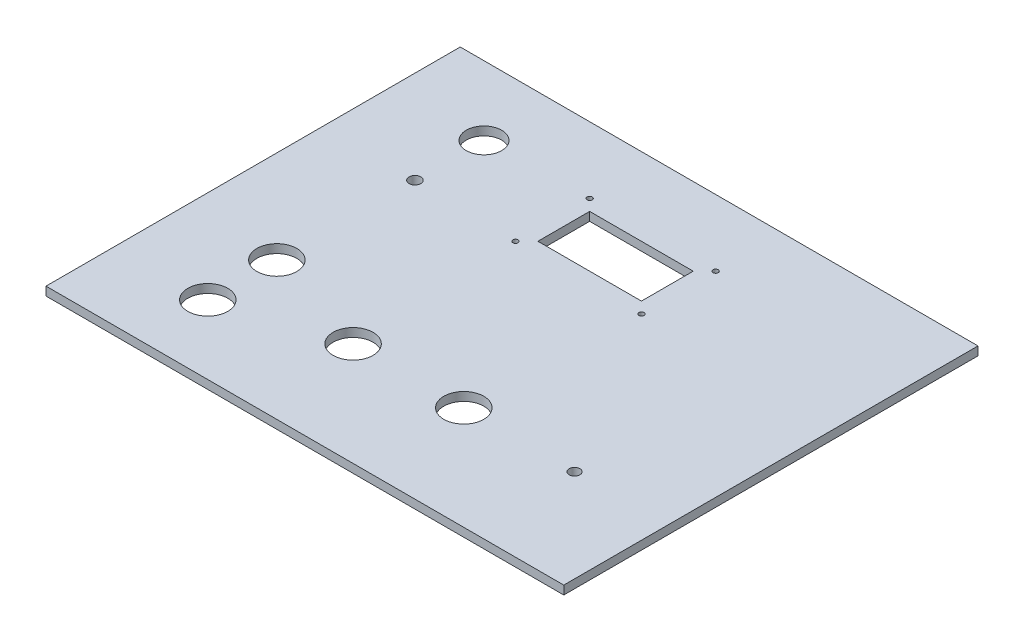
ISO-10303-21;
HEADER;
FILE_DESCRIPTION(('STEP AP214'),'2;1');
FILE_NAME('part.step','',(''),(''),'','','');
FILE_SCHEMA(('AUTOMOTIVE_DESIGN { 1 0 10303 214 1 1 1 1 }'));
ENDSEC;
DATA;
#1=APPLICATION_CONTEXT('core data for automotive mechanical design processes');
#2=APPLICATION_PROTOCOL_DEFINITION('international standard','automotive_design',2000,#1);
#3=PRODUCT_CONTEXT('',#1,'mechanical');
#4=PRODUCT('Part','Part','',(#3));
#5=PRODUCT_RELATED_PRODUCT_CATEGORY('part','',(#4));
#6=PRODUCT_DEFINITION_FORMATION('','',#4);
#7=PRODUCT_DEFINITION_CONTEXT('part definition',#1,'design');
#8=PRODUCT_DEFINITION('design','',#6,#7);
#9=PRODUCT_DEFINITION_SHAPE('','',#8);
#10=(LENGTH_UNIT() NAMED_UNIT(*) SI_UNIT(.MILLI.,.METRE.));
#11=(NAMED_UNIT(*) PLANE_ANGLE_UNIT() SI_UNIT($,.RADIAN.));
#12=(NAMED_UNIT(*) SI_UNIT($,.STERADIAN.) SOLID_ANGLE_UNIT());
#13=UNCERTAINTY_MEASURE_WITH_UNIT(LENGTH_MEASURE(1.E-05),#10,'distance_accuracy_value','');
#14=(GEOMETRIC_REPRESENTATION_CONTEXT(3) GLOBAL_UNCERTAINTY_ASSIGNED_CONTEXT((#13)) GLOBAL_UNIT_ASSIGNED_CONTEXT((#10,
#11,#12)) REPRESENTATION_CONTEXT('',''));
#15=CARTESIAN_POINT('',(0.,0.,0.));
#16=DIRECTION('',(0.,0.,1.));
#17=DIRECTION('',(1.,0.,0.));
#18=AXIS2_PLACEMENT_3D('',#15,#16,#17);
#19=CARTESIAN_POINT('',(150.,5.,120.));
#20=DIRECTION('',(-1.,0.,0.));
#21=DIRECTION('',(0.,0.,1.));
#22=AXIS2_PLACEMENT_3D('',#19,#20,#21);
#23=PLANE('',#22);
#24=DIRECTION('',(0.,0.,-1.));
#25=VECTOR('',#24,1.);
#26=CARTESIAN_POINT('',(150.,0.,120.));
#27=LINE('',#26,#25);
#28=CARTESIAN_POINT('',(150.,0.,120.));
#29=VERTEX_POINT('',#28);
#30=CARTESIAN_POINT('',(150.,0.,-120.));
#31=VERTEX_POINT('',#30);
#32=EDGE_CURVE('E215',#29,#31,#27,.T.);
#33=ORIENTED_EDGE('',*,*,#32,.T.);
#34=DIRECTION('',(0.,-1.,0.));
#35=VECTOR('',#34,1.);
#36=CARTESIAN_POINT('',(150.,5.,-120.));
#37=LINE('',#36,#35);
#38=CARTESIAN_POINT('',(150.,5.,-120.));
#39=VERTEX_POINT('',#38);
#40=EDGE_CURVE('E11',#39,#31,#37,.T.);
#41=ORIENTED_EDGE('',*,*,#40,.F.);
#42=DIRECTION('',(0.,0.,-1.));
#43=VECTOR('',#42,1.);
#44=CARTESIAN_POINT('',(150.,5.,120.));
#45=LINE('',#44,#43);
#46=CARTESIAN_POINT('',(150.,5.,120.));
#47=VERTEX_POINT('',#46);
#48=EDGE_CURVE('E219',#47,#39,#45,.T.);
#49=ORIENTED_EDGE('',*,*,#48,.F.);
#50=DIRECTION('',(0.,-1.,0.));
#51=VECTOR('',#50,1.);
#52=CARTESIAN_POINT('',(150.,5.,120.));
#53=LINE('',#52,#51);
#54=EDGE_CURVE('E233',#47,#29,#53,.T.);
#55=ORIENTED_EDGE('',*,*,#54,.T.);
#56=EDGE_LOOP('',(#33,#41,#49,#55));
#57=FACE_BOUND('',#56,.T.);
#58=ADVANCED_FACE('F37',(#57),#23,.F.);
#59=CARTESIAN_POINT('',(-150.,5.,-120.));
#60=DIRECTION('',(0.,0.,1.));
#61=DIRECTION('',(1.,0.,0.));
#62=AXIS2_PLACEMENT_3D('',#59,#60,#61);
#63=PLANE('',#62);
#64=DIRECTION('',(-1.,0.,0.));
#65=VECTOR('',#64,1.);
#66=CARTESIAN_POINT('',(-150.,0.,-120.));
#67=LINE('',#66,#65);
#68=CARTESIAN_POINT('',(-150.,0.,-120.));
#69=VERTEX_POINT('',#68);
#70=EDGE_CURVE('E237',#31,#69,#67,.T.);
#71=ORIENTED_EDGE('',*,*,#70,.T.);
#72=DIRECTION('',(0.,-1.,0.));
#73=VECTOR('',#72,1.);
#74=CARTESIAN_POINT('',(-150.,5.,-120.));
#75=LINE('',#74,#73);
#76=CARTESIAN_POINT('',(-150.,5.,-120.));
#77=VERTEX_POINT('',#76);
#78=EDGE_CURVE('E45',#77,#69,#75,.T.);
#79=ORIENTED_EDGE('',*,*,#78,.F.);
#80=DIRECTION('',(-1.,0.,0.));
#81=VECTOR('',#80,1.);
#82=CARTESIAN_POINT('',(-150.,5.,-120.));
#83=LINE('',#82,#81);
#84=EDGE_CURVE('E223',#39,#77,#83,.T.);
#85=ORIENTED_EDGE('',*,*,#84,.F.);
#86=ORIENTED_EDGE('',*,*,#40,.T.);
#87=EDGE_LOOP('',(#71,#79,#85,#86));
#88=FACE_BOUND('',#87,.T.);
#89=ADVANCED_FACE('F273',(#88),#63,.F.);
#90=CARTESIAN_POINT('',(-150.,5.,120.));
#91=DIRECTION('',(1.,0.,0.));
#92=DIRECTION('',(0.,0.,-1.));
#93=AXIS2_PLACEMENT_3D('',#90,#91,#92);
#94=PLANE('',#93);
#95=DIRECTION('',(0.,0.,1.));
#96=VECTOR('',#95,1.);
#97=CARTESIAN_POINT('',(-150.,0.,120.));
#98=LINE('',#97,#96);
#99=CARTESIAN_POINT('',(-150.,0.,120.));
#100=VERTEX_POINT('',#99);
#101=EDGE_CURVE('E240',#69,#100,#98,.T.);
#102=ORIENTED_EDGE('',*,*,#101,.T.);
#103=DIRECTION('',(0.,-1.,0.));
#104=VECTOR('',#103,1.);
#105=CARTESIAN_POINT('',(-150.,5.,120.));
#106=LINE('',#105,#104);
#107=CARTESIAN_POINT('',(-150.,5.,120.));
#108=VERTEX_POINT('',#107);
#109=EDGE_CURVE('E248',#108,#100,#106,.T.);
#110=ORIENTED_EDGE('',*,*,#109,.F.);
#111=DIRECTION('',(0.,0.,1.));
#112=VECTOR('',#111,1.);
#113=CARTESIAN_POINT('',(-150.,5.,120.));
#114=LINE('',#113,#112);
#115=EDGE_CURVE('E227',#77,#108,#114,.T.);
#116=ORIENTED_EDGE('',*,*,#115,.F.);
#117=ORIENTED_EDGE('',*,*,#78,.T.);
#118=EDGE_LOOP('',(#102,#110,#116,#117));
#119=FACE_BOUND('',#118,.T.);
#120=ADVANCED_FACE('F258',(#119),#94,.F.);
#121=CARTESIAN_POINT('',(-150.,5.,120.));
#122=DIRECTION('',(0.,0.,-1.));
#123=DIRECTION('',(-1.,0.,0.));
#124=AXIS2_PLACEMENT_3D('',#121,#122,#123);
#125=PLANE('',#124);
#126=DIRECTION('',(1.,0.,0.));
#127=VECTOR('',#126,1.);
#128=CARTESIAN_POINT('',(-150.,0.,120.));
#129=LINE('',#128,#127);
#130=EDGE_CURVE('E224',#100,#29,#129,.T.);
#131=ORIENTED_EDGE('',*,*,#130,.T.);
#132=ORIENTED_EDGE('',*,*,#54,.F.);
#133=DIRECTION('',(1.,0.,0.));
#134=VECTOR('',#133,1.);
#135=CARTESIAN_POINT('',(-150.,5.,120.));
#136=LINE('',#135,#134);
#137=EDGE_CURVE('E230',#108,#47,#136,.T.);
#138=ORIENTED_EDGE('',*,*,#137,.F.);
#139=ORIENTED_EDGE('',*,*,#109,.T.);
#140=EDGE_LOOP('',(#131,#132,#138,#139));
#141=FACE_BOUND('',#140,.T.);
#142=ADVANCED_FACE('F267',(#141),#125,.F.);
#143=CARTESIAN_POINT('',(0.,5.,0.));
#144=DIRECTION('',(0.,-1.,0.));
#145=DIRECTION('',(0.,0.,-1.));
#146=AXIS2_PLACEMENT_3D('',#143,#144,#145);
#147=PLANE('',#146);
#148=CARTESIAN_POINT('',(-96.2500000000001,5.,40.));
#149=DIRECTION('',(0.,1.,0.));
#150=DIRECTION('',(0.,0.,1.));
#151=AXIS2_PLACEMENT_3D('',#148,#149,#150);
#152=CIRCLE('',#151,11.58);
#153=CARTESIAN_POINT('',(-96.2500000000001,5.,51.58));
#154=VERTEX_POINT('',#153);
#155=EDGE_CURVE('E170',#154,#154,#152,.T.);
#156=ORIENTED_EDGE('',*,*,#155,.F.);
#157=EDGE_LOOP('',(#156));
#158=FACE_BOUND('',#157,.T.);
#159=CARTESIAN_POINT('',(-96.2500000000001,5.,-40.));
#160=DIRECTION('',(0.,1.,0.));
#161=DIRECTION('',(0.,0.,1.));
#162=AXIS2_PLACEMENT_3D('',#159,#160,#161);
#163=CIRCLE('',#162,3.4);
#164=CARTESIAN_POINT('',(-96.2500000000001,5.,-36.6));
#165=VERTEX_POINT('',#164);
#166=EDGE_CURVE('E162',#165,#165,#163,.T.);
#167=ORIENTED_EDGE('',*,*,#166,.F.);
#168=EDGE_LOOP('',(#167));
#169=FACE_BOUND('',#168,.T.);
#170=CARTESIAN_POINT('',(-96.2500000000001,5.,-80.));
#171=DIRECTION('',(0.,1.,0.));
#172=DIRECTION('',(0.,0.,1.));
#173=AXIS2_PLACEMENT_3D('',#170,#171,#172);
#174=CIRCLE('',#173,10.25);
#175=CARTESIAN_POINT('',(-96.2500000000001,5.,-69.75));
#176=VERTEX_POINT('',#175);
#177=EDGE_CURVE('E139',#176,#176,#174,.T.);
#178=ORIENTED_EDGE('',*,*,#177,.F.);
#179=EDGE_LOOP('',(#178));
#180=FACE_BOUND('',#179,.T.);
#181=DIRECTION('',(0.,0.,-1.));
#182=VECTOR('',#181,1.);
#183=CARTESIAN_POINT('',(30.,5.,-45.));
#184=LINE('',#183,#182);
#185=CARTESIAN_POINT('',(30.,5.,-45.));
#186=VERTEX_POINT('',#185);
#187=CARTESIAN_POINT('',(30.,5.,-75.));
#188=VERTEX_POINT('',#187);
#189=EDGE_CURVE('E102',#186,#188,#184,.T.);
#190=ORIENTED_EDGE('',*,*,#189,.F.);
#191=DIRECTION('',(1.,0.,0.));
#192=VECTOR('',#191,1.);
#193=CARTESIAN_POINT('',(-30.,5.,-45.));
#194=LINE('',#193,#192);
#195=CARTESIAN_POINT('',(-30.,5.,-45.));
#196=VERTEX_POINT('',#195);
#197=EDGE_CURVE('E131',#196,#186,#194,.T.);
#198=ORIENTED_EDGE('',*,*,#197,.F.);
#199=DIRECTION('',(0.,0.,1.));
#200=VECTOR('',#199,1.);
#201=CARTESIAN_POINT('',(-30.,5.,-45.));
#202=LINE('',#201,#200);
#203=CARTESIAN_POINT('',(-30.,5.,-75.));
#204=VERTEX_POINT('',#203);
#205=EDGE_CURVE('E126',#204,#196,#202,.T.);
#206=ORIENTED_EDGE('',*,*,#205,.F.);
#207=DIRECTION('',(-1.,0.,0.));
#208=VECTOR('',#207,1.);
#209=CARTESIAN_POINT('',(-30.,5.,-75.));
#210=LINE('',#209,#208);
#211=EDGE_CURVE('E111',#188,#204,#210,.T.);
#212=ORIENTED_EDGE('',*,*,#211,.F.);
#213=EDGE_LOOP('',(#190,#198,#206,#212));
#214=FACE_BOUND('',#213,.T.);
#215=CARTESIAN_POINT('',(96.2500000000001,5.,60.));
#216=DIRECTION('',(0.,1.,0.));
#217=DIRECTION('',(0.,0.,1.));
#218=AXIS2_PLACEMENT_3D('',#215,#216,#217);
#219=CIRCLE('',#218,3.1);
#220=CARTESIAN_POINT('',(96.2500000000001,5.,63.1));
#221=VERTEX_POINT('',#220);
#222=EDGE_CURVE('E204',#221,#221,#219,.T.);
#223=ORIENTED_EDGE('',*,*,#222,.F.);
#224=EDGE_LOOP('',(#223));
#225=FACE_BOUND('',#224,.T.);
#226=CARTESIAN_POINT('',(-36.5,5.,-38.5));
#227=DIRECTION('',(0.,1.,0.));
#228=DIRECTION('',(0.,0.,1.));
#229=AXIS2_PLACEMENT_3D('',#226,#227,#228);
#230=CIRCLE('',#229,1.5);
#231=CARTESIAN_POINT('',(-36.5,5.,-37.));
#232=VERTEX_POINT('',#231);
#233=EDGE_CURVE('E196',#232,#232,#230,.T.);
#234=ORIENTED_EDGE('',*,*,#233,.F.);
#235=EDGE_LOOP('',(#234));
#236=FACE_BOUND('',#235,.T.);
#237=CARTESIAN_POINT('',(-36.5,5.,-81.5));
#238=DIRECTION('',(0.,1.,0.));
#239=DIRECTION('',(0.,0.,1.));
#240=AXIS2_PLACEMENT_3D('',#237,#238,#239);
#241=CIRCLE('',#240,1.5);
#242=CARTESIAN_POINT('',(-36.5,5.,-80.));
#243=VERTEX_POINT('',#242);
#244=EDGE_CURVE('E188',#243,#243,#241,.T.);
#245=ORIENTED_EDGE('',*,*,#244,.F.);
#246=EDGE_LOOP('',(#245));
#247=FACE_BOUND('',#246,.T.);
#248=CARTESIAN_POINT('',(36.5,5.,-81.5));
#249=DIRECTION('',(0.,1.,0.));
#250=DIRECTION('',(0.,0.,1.));
#251=AXIS2_PLACEMENT_3D('',#248,#249,#250);
#252=CIRCLE('',#251,1.5);
#253=CARTESIAN_POINT('',(36.5,5.,-80.));
#254=VERTEX_POINT('',#253);
#255=EDGE_CURVE('E179',#254,#254,#252,.T.);
#256=ORIENTED_EDGE('',*,*,#255,.F.);
#257=EDGE_LOOP('',(#256));
#258=FACE_BOUND('',#257,.T.);
#259=CARTESIAN_POINT('',(-96.2500000000001,5.,80.));
#260=DIRECTION('',(0.,1.,0.));
#261=DIRECTION('',(0.,0.,1.));
#262=AXIS2_PLACEMENT_3D('',#259,#260,#261);
#263=CIRCLE('',#262,11.58);
#264=CARTESIAN_POINT('',(-96.2500000000001,5.,91.58));
#265=VERTEX_POINT('',#264);
#266=EDGE_CURVE('E178',#265,#265,#263,.T.);
#267=ORIENTED_EDGE('',*,*,#266,.F.);
#268=EDGE_LOOP('',(#267));
#269=FACE_BOUND('',#268,.T.);
#270=CARTESIAN_POINT('',(-32.0800000000001,5.,60.));
#271=DIRECTION('',(0.,1.,0.));
#272=DIRECTION('',(0.,0.,1.));
#273=AXIS2_PLACEMENT_3D('',#270,#271,#272);
#274=CIRCLE('',#273,11.58);
#275=CARTESIAN_POINT('',(-32.0800000000001,5.,71.58));
#276=VERTEX_POINT('',#275);
#277=EDGE_CURVE('E353',#276,#276,#274,.T.);
#278=ORIENTED_EDGE('',*,*,#277,.F.);
#279=EDGE_LOOP('',(#278));
#280=FACE_BOUND('',#279,.T.);
#281=CARTESIAN_POINT('',(32.0800000000001,5.,60.));
#282=DIRECTION('',(0.,1.,0.));
#283=DIRECTION('',(0.,0.,1.));
#284=AXIS2_PLACEMENT_3D('',#281,#282,#283);
#285=CIRCLE('',#284,11.58);
#286=CARTESIAN_POINT('',(32.0800000000001,5.,71.58));
#287=VERTEX_POINT('',#286);
#288=EDGE_CURVE('E366',#287,#287,#285,.T.);
#289=ORIENTED_EDGE('',*,*,#288,.F.);
#290=EDGE_LOOP('',(#289));
#291=FACE_BOUND('',#290,.T.);
#292=CARTESIAN_POINT('',(36.5,5.,-38.5));
#293=DIRECTION('',(0.,1.,0.));
#294=DIRECTION('',(0.,0.,1.));
#295=AXIS2_PLACEMENT_3D('',#292,#293,#294);
#296=CIRCLE('',#295,1.5);
#297=CARTESIAN_POINT('',(36.5,5.,-37.));
#298=VERTEX_POINT('',#297);
#299=EDGE_CURVE('E211',#298,#298,#296,.T.);
#300=ORIENTED_EDGE('',*,*,#299,.F.);
#301=EDGE_LOOP('',(#300));
#302=FACE_BOUND('',#301,.T.);
#303=ORIENTED_EDGE('',*,*,#48,.T.);
#304=ORIENTED_EDGE('',*,*,#84,.T.);
#305=ORIENTED_EDGE('',*,*,#115,.T.);
#306=ORIENTED_EDGE('',*,*,#137,.T.);
#307=EDGE_LOOP('',(#303,#304,#305,#306));
#308=FACE_BOUND('',#307,.T.);
#309=ADVANCED_FACE('F124',(#158,#169,#180,#214,#225,#236,#247,#258,#269,#280,#291,#302,#308),
#147,.F.);
#310=CARTESIAN_POINT('',(0.,0.,0.));
#311=DIRECTION('',(0.,-1.,0.));
#312=DIRECTION('',(0.,0.,-1.));
#313=AXIS2_PLACEMENT_3D('',#310,#311,#312);
#314=PLANE('',#313);
#315=CARTESIAN_POINT('',(-96.2500000000001,0.,40.));
#316=DIRECTION('',(0.,1.,0.));
#317=DIRECTION('',(0.,0.,1.));
#318=AXIS2_PLACEMENT_3D('',#315,#316,#317);
#319=CIRCLE('',#318,11.58);
#320=CARTESIAN_POINT('',(-96.2500000000001,0.,51.58));
#321=VERTEX_POINT('',#320);
#322=EDGE_CURVE('E174',#321,#321,#319,.T.);
#323=ORIENTED_EDGE('',*,*,#322,.T.);
#324=EDGE_LOOP('',(#323));
#325=FACE_BOUND('',#324,.T.);
#326=CARTESIAN_POINT('',(-96.2500000000001,0.,-40.));
#327=DIRECTION('',(0.,1.,0.));
#328=DIRECTION('',(0.,0.,1.));
#329=AXIS2_PLACEMENT_3D('',#326,#327,#328);
#330=CIRCLE('',#329,3.4);
#331=CARTESIAN_POINT('',(-96.2500000000001,0.,-36.6));
#332=VERTEX_POINT('',#331);
#333=EDGE_CURVE('E166',#332,#332,#330,.T.);
#334=ORIENTED_EDGE('',*,*,#333,.T.);
#335=EDGE_LOOP('',(#334));
#336=FACE_BOUND('',#335,.T.);
#337=CARTESIAN_POINT('',(-96.2500000000001,0.,-80.));
#338=DIRECTION('',(0.,1.,0.));
#339=DIRECTION('',(0.,0.,1.));
#340=AXIS2_PLACEMENT_3D('',#337,#338,#339);
#341=CIRCLE('',#340,10.25);
#342=CARTESIAN_POINT('',(-96.2500000000001,0.,-69.75));
#343=VERTEX_POINT('',#342);
#344=EDGE_CURVE('E158',#343,#343,#341,.T.);
#345=ORIENTED_EDGE('',*,*,#344,.T.);
#346=EDGE_LOOP('',(#345));
#347=FACE_BOUND('',#346,.T.);
#348=DIRECTION('',(1.,0.,0.));
#349=VECTOR('',#348,1.);
#350=CARTESIAN_POINT('',(-30.,0.,-45.));
#351=LINE('',#350,#349);
#352=CARTESIAN_POINT('',(-30.,0.,-45.));
#353=VERTEX_POINT('',#352);
#354=CARTESIAN_POINT('',(30.,0.,-45.));
#355=VERTEX_POINT('',#354);
#356=EDGE_CURVE('E112',#353,#355,#351,.T.);
#357=ORIENTED_EDGE('',*,*,#356,.T.);
#358=DIRECTION('',(0.,0.,-1.));
#359=VECTOR('',#358,1.);
#360=CARTESIAN_POINT('',(30.,0.,-45.));
#361=LINE('',#360,#359);
#362=CARTESIAN_POINT('',(30.,0.,-75.));
#363=VERTEX_POINT('',#362);
#364=EDGE_CURVE('E60',#355,#363,#361,.T.);
#365=ORIENTED_EDGE('',*,*,#364,.T.);
#366=DIRECTION('',(-1.,0.,0.));
#367=VECTOR('',#366,1.);
#368=CARTESIAN_POINT('',(-30.,0.,-75.));
#369=LINE('',#368,#367);
#370=CARTESIAN_POINT('',(-30.,0.,-75.));
#371=VERTEX_POINT('',#370);
#372=EDGE_CURVE('E118',#363,#371,#369,.T.);
#373=ORIENTED_EDGE('',*,*,#372,.T.);
#374=DIRECTION('',(0.,0.,1.));
#375=VECTOR('',#374,1.);
#376=CARTESIAN_POINT('',(-30.,0.,-45.));
#377=LINE('',#376,#375);
#378=EDGE_CURVE('E142',#371,#353,#377,.T.);
#379=ORIENTED_EDGE('',*,*,#378,.T.);
#380=EDGE_LOOP('',(#357,#365,#373,#379));
#381=FACE_BOUND('',#380,.T.);
#382=CARTESIAN_POINT('',(96.2500000000001,0.,60.));
#383=DIRECTION('',(0.,1.,0.));
#384=DIRECTION('',(0.,0.,1.));
#385=AXIS2_PLACEMENT_3D('',#382,#383,#384);
#386=CIRCLE('',#385,3.1);
#387=CARTESIAN_POINT('',(96.2500000000001,0.,63.1));
#388=VERTEX_POINT('',#387);
#389=EDGE_CURVE('E120',#388,#388,#386,.T.);
#390=ORIENTED_EDGE('',*,*,#389,.T.);
#391=EDGE_LOOP('',(#390));
#392=FACE_BOUND('',#391,.T.);
#393=CARTESIAN_POINT('',(-36.5,0.,-38.5));
#394=DIRECTION('',(0.,1.,0.));
#395=DIRECTION('',(0.,0.,1.));
#396=AXIS2_PLACEMENT_3D('',#393,#394,#395);
#397=CIRCLE('',#396,1.5);
#398=CARTESIAN_POINT('',(-36.5,0.,-37.));
#399=VERTEX_POINT('',#398);
#400=EDGE_CURVE('E200',#399,#399,#397,.T.);
#401=ORIENTED_EDGE('',*,*,#400,.T.);
#402=EDGE_LOOP('',(#401));
#403=FACE_BOUND('',#402,.T.);
#404=CARTESIAN_POINT('',(-36.5,0.,-81.5));
#405=DIRECTION('',(0.,1.,0.));
#406=DIRECTION('',(0.,0.,1.));
#407=AXIS2_PLACEMENT_3D('',#404,#405,#406);
#408=CIRCLE('',#407,1.5);
#409=CARTESIAN_POINT('',(-36.5,0.,-80.));
#410=VERTEX_POINT('',#409);
#411=EDGE_CURVE('E192',#410,#410,#408,.T.);
#412=ORIENTED_EDGE('',*,*,#411,.T.);
#413=EDGE_LOOP('',(#412));
#414=FACE_BOUND('',#413,.T.);
#415=CARTESIAN_POINT('',(36.5,0.,-81.5));
#416=DIRECTION('',(0.,1.,0.));
#417=DIRECTION('',(0.,0.,1.));
#418=AXIS2_PLACEMENT_3D('',#415,#416,#417);
#419=CIRCLE('',#418,1.5);
#420=CARTESIAN_POINT('',(36.5,0.,-80.));
#421=VERTEX_POINT('',#420);
#422=EDGE_CURVE('E184',#421,#421,#419,.T.);
#423=ORIENTED_EDGE('',*,*,#422,.T.);
#424=EDGE_LOOP('',(#423));
#425=FACE_BOUND('',#424,.T.);
#426=CARTESIAN_POINT('',(-96.2500000000001,0.,80.));
#427=DIRECTION('',(0.,1.,0.));
#428=DIRECTION('',(0.,0.,1.));
#429=AXIS2_PLACEMENT_3D('',#426,#427,#428);
#430=CIRCLE('',#429,11.58);
#431=CARTESIAN_POINT('',(-96.2500000000001,0.,91.58));
#432=VERTEX_POINT('',#431);
#433=EDGE_CURVE('E350',#432,#432,#430,.T.);
#434=ORIENTED_EDGE('',*,*,#433,.T.);
#435=EDGE_LOOP('',(#434));
#436=FACE_BOUND('',#435,.T.);
#437=CARTESIAN_POINT('',(-32.0800000000001,0.,60.));
#438=DIRECTION('',(0.,1.,0.));
#439=DIRECTION('',(0.,0.,1.));
#440=AXIS2_PLACEMENT_3D('',#437,#438,#439);
#441=CIRCLE('',#440,11.58);
#442=CARTESIAN_POINT('',(-32.0800000000001,0.,71.58));
#443=VERTEX_POINT('',#442);
#444=EDGE_CURVE('E360',#443,#443,#441,.T.);
#445=ORIENTED_EDGE('',*,*,#444,.T.);
#446=EDGE_LOOP('',(#445));
#447=FACE_BOUND('',#446,.T.);
#448=CARTESIAN_POINT('',(32.0800000000001,0.,60.));
#449=DIRECTION('',(0.,1.,0.));
#450=DIRECTION('',(0.,0.,1.));
#451=AXIS2_PLACEMENT_3D('',#448,#449,#450);
#452=CIRCLE('',#451,11.58);
#453=CARTESIAN_POINT('',(32.0800000000001,0.,71.58));
#454=VERTEX_POINT('',#453);
#455=EDGE_CURVE('E369',#454,#454,#452,.T.);
#456=ORIENTED_EDGE('',*,*,#455,.T.);
#457=EDGE_LOOP('',(#456));
#458=FACE_BOUND('',#457,.T.);
#459=CARTESIAN_POINT('',(36.5,0.,-38.5));
#460=DIRECTION('',(0.,1.,0.));
#461=DIRECTION('',(0.,0.,1.));
#462=AXIS2_PLACEMENT_3D('',#459,#460,#461);
#463=CIRCLE('',#462,1.5);
#464=CARTESIAN_POINT('',(36.5,0.,-37.));
#465=VERTEX_POINT('',#464);
#466=EDGE_CURVE('E183',#465,#465,#463,.T.);
#467=ORIENTED_EDGE('',*,*,#466,.T.);
#468=EDGE_LOOP('',(#467));
#469=FACE_BOUND('',#468,.T.);
#470=ORIENTED_EDGE('',*,*,#32,.F.);
#471=ORIENTED_EDGE('',*,*,#130,.F.);
#472=ORIENTED_EDGE('',*,*,#101,.F.);
#473=ORIENTED_EDGE('',*,*,#70,.F.);
#474=EDGE_LOOP('',(#470,#471,#472,#473));
#475=FACE_BOUND('',#474,.T.);
#476=ADVANCED_FACE('F264',(#325,#336,#347,#381,#392,#403,#414,#425,#436,#447,#458,#469,#475),
#314,.T.);
#477=CARTESIAN_POINT('',(36.5,5.,-38.5));
#478=DIRECTION('',(0.,-1.,0.));
#479=DIRECTION('',(0.,0.,-1.));
#480=AXIS2_PLACEMENT_3D('',#477,#478,#479);
#481=CYLINDRICAL_SURFACE('',#480,1.5);
#482=ORIENTED_EDGE('',*,*,#299,.T.);
#483=EDGE_LOOP('',(#482));
#484=FACE_BOUND('',#483,.T.);
#485=ORIENTED_EDGE('',*,*,#466,.F.);
#486=EDGE_LOOP('',(#485));
#487=FACE_BOUND('',#486,.T.);
#488=ADVANCED_FACE('F285',(#484,#487),#481,.F.);
#489=CARTESIAN_POINT('',(32.0800000000001,5.,60.));
#490=DIRECTION('',(0.,-1.,0.));
#491=DIRECTION('',(0.,0.,-1.));
#492=AXIS2_PLACEMENT_3D('',#489,#490,#491);
#493=CYLINDRICAL_SURFACE('',#492,11.58);
#494=ORIENTED_EDGE('',*,*,#288,.T.);
#495=EDGE_LOOP('',(#494));
#496=FACE_BOUND('',#495,.T.);
#497=ORIENTED_EDGE('',*,*,#455,.F.);
#498=EDGE_LOOP('',(#497));
#499=FACE_BOUND('',#498,.T.);
#500=ADVANCED_FACE('F292',(#496,#499),#493,.F.);
#501=CARTESIAN_POINT('',(-32.0800000000001,5.,60.));
#502=DIRECTION('',(0.,-1.,0.));
#503=DIRECTION('',(0.,0.,-1.));
#504=AXIS2_PLACEMENT_3D('',#501,#502,#503);
#505=CYLINDRICAL_SURFACE('',#504,11.58);
#506=ORIENTED_EDGE('',*,*,#277,.T.);
#507=EDGE_LOOP('',(#506));
#508=FACE_BOUND('',#507,.T.);
#509=ORIENTED_EDGE('',*,*,#444,.F.);
#510=EDGE_LOOP('',(#509));
#511=FACE_BOUND('',#510,.T.);
#512=ADVANCED_FACE('F336',(#508,#511),#505,.F.);
#513=CARTESIAN_POINT('',(-96.2500000000001,5.,80.));
#514=DIRECTION('',(0.,-1.,0.));
#515=DIRECTION('',(0.,0.,-1.));
#516=AXIS2_PLACEMENT_3D('',#513,#514,#515);
#517=CYLINDRICAL_SURFACE('',#516,11.58);
#518=ORIENTED_EDGE('',*,*,#266,.T.);
#519=EDGE_LOOP('',(#518));
#520=FACE_BOUND('',#519,.T.);
#521=ORIENTED_EDGE('',*,*,#433,.F.);
#522=EDGE_LOOP('',(#521));
#523=FACE_BOUND('',#522,.T.);
#524=ADVANCED_FACE('F309',(#520,#523),#517,.F.);
#525=CARTESIAN_POINT('',(36.5,5.,-81.5));
#526=DIRECTION('',(0.,-1.,0.));
#527=DIRECTION('',(0.,0.,-1.));
#528=AXIS2_PLACEMENT_3D('',#525,#526,#527);
#529=CYLINDRICAL_SURFACE('',#528,1.5);
#530=ORIENTED_EDGE('',*,*,#255,.T.);
#531=EDGE_LOOP('',(#530));
#532=FACE_BOUND('',#531,.T.);
#533=ORIENTED_EDGE('',*,*,#422,.F.);
#534=EDGE_LOOP('',(#533));
#535=FACE_BOUND('',#534,.T.);
#536=ADVANCED_FACE('F305',(#532,#535),#529,.F.);
#537=CARTESIAN_POINT('',(-36.5,5.,-81.5));
#538=DIRECTION('',(0.,-1.,0.));
#539=DIRECTION('',(0.,0.,-1.));
#540=AXIS2_PLACEMENT_3D('',#537,#538,#539);
#541=CYLINDRICAL_SURFACE('',#540,1.5);
#542=ORIENTED_EDGE('',*,*,#244,.T.);
#543=EDGE_LOOP('',(#542));
#544=FACE_BOUND('',#543,.T.);
#545=ORIENTED_EDGE('',*,*,#411,.F.);
#546=EDGE_LOOP('',(#545));
#547=FACE_BOUND('',#546,.T.);
#548=ADVANCED_FACE('F301',(#544,#547),#541,.F.);
#549=CARTESIAN_POINT('',(-36.5,5.,-38.5));
#550=DIRECTION('',(0.,-1.,0.));
#551=DIRECTION('',(0.,0.,-1.));
#552=AXIS2_PLACEMENT_3D('',#549,#550,#551);
#553=CYLINDRICAL_SURFACE('',#552,1.5);
#554=ORIENTED_EDGE('',*,*,#233,.T.);
#555=EDGE_LOOP('',(#554));
#556=FACE_BOUND('',#555,.T.);
#557=ORIENTED_EDGE('',*,*,#400,.F.);
#558=EDGE_LOOP('',(#557));
#559=FACE_BOUND('',#558,.T.);
#560=ADVANCED_FACE('F297',(#556,#559),#553,.F.);
#561=CARTESIAN_POINT('',(96.2500000000001,5.,60.));
#562=DIRECTION('',(0.,-1.,0.));
#563=DIRECTION('',(0.,0.,-1.));
#564=AXIS2_PLACEMENT_3D('',#561,#562,#563);
#565=CYLINDRICAL_SURFACE('',#564,3.1);
#566=ORIENTED_EDGE('',*,*,#222,.T.);
#567=EDGE_LOOP('',(#566));
#568=FACE_BOUND('',#567,.T.);
#569=ORIENTED_EDGE('',*,*,#389,.F.);
#570=EDGE_LOOP('',(#569));
#571=FACE_BOUND('',#570,.T.);
#572=ADVANCED_FACE('F294',(#568,#571),#565,.F.);
#573=CARTESIAN_POINT('',(30.,5.,-45.));
#574=DIRECTION('',(-1.,0.,0.));
#575=DIRECTION('',(0.,0.,1.));
#576=AXIS2_PLACEMENT_3D('',#573,#574,#575);
#577=PLANE('',#576);
#578=ORIENTED_EDGE('',*,*,#364,.F.);
#579=DIRECTION('',(0.,-1.,0.));
#580=VECTOR('',#579,1.);
#581=CARTESIAN_POINT('',(30.,5.,-45.));
#582=LINE('',#581,#580);
#583=EDGE_CURVE('E106',#186,#355,#582,.T.);
#584=ORIENTED_EDGE('',*,*,#583,.F.);
#585=ORIENTED_EDGE('',*,*,#189,.T.);
#586=DIRECTION('',(0.,-1.,0.));
#587=VECTOR('',#586,1.);
#588=CARTESIAN_POINT('',(30.,5.,-75.));
#589=LINE('',#588,#587);
#590=EDGE_CURVE('E105',#188,#363,#589,.T.);
#591=ORIENTED_EDGE('',*,*,#590,.T.);
#592=EDGE_LOOP('',(#578,#584,#585,#591));
#593=FACE_BOUND('',#592,.T.);
#594=ADVANCED_FACE('F104',(#593),#577,.T.);
#595=CARTESIAN_POINT('',(-30.,5.,-75.));
#596=DIRECTION('',(0.,0.,1.));
#597=DIRECTION('',(1.,0.,0.));
#598=AXIS2_PLACEMENT_3D('',#595,#596,#597);
#599=PLANE('',#598);
#600=ORIENTED_EDGE('',*,*,#372,.F.);
#601=ORIENTED_EDGE('',*,*,#590,.F.);
#602=ORIENTED_EDGE('',*,*,#211,.T.);
#603=DIRECTION('',(0.,-1.,0.));
#604=VECTOR('',#603,1.);
#605=CARTESIAN_POINT('',(-30.,5.,-75.));
#606=LINE('',#605,#604);
#607=EDGE_CURVE('E121',#204,#371,#606,.T.);
#608=ORIENTED_EDGE('',*,*,#607,.T.);
#609=EDGE_LOOP('',(#600,#601,#602,#608));
#610=FACE_BOUND('',#609,.T.);
#611=ADVANCED_FACE('F115',(#610),#599,.T.);
#612=CARTESIAN_POINT('',(-30.,5.,-45.));
#613=DIRECTION('',(1.,0.,0.));
#614=DIRECTION('',(0.,0.,-1.));
#615=AXIS2_PLACEMENT_3D('',#612,#613,#614);
#616=PLANE('',#615);
#617=ORIENTED_EDGE('',*,*,#378,.F.);
#618=ORIENTED_EDGE('',*,*,#607,.F.);
#619=ORIENTED_EDGE('',*,*,#205,.T.);
#620=DIRECTION('',(0.,-1.,0.));
#621=VECTOR('',#620,1.);
#622=CARTESIAN_POINT('',(-30.,5.,-45.));
#623=LINE('',#622,#621);
#624=EDGE_CURVE('E52',#196,#353,#623,.T.);
#625=ORIENTED_EDGE('',*,*,#624,.T.);
#626=EDGE_LOOP('',(#617,#618,#619,#625));
#627=FACE_BOUND('',#626,.T.);
#628=ADVANCED_FACE('F328',(#627),#616,.T.);
#629=CARTESIAN_POINT('',(-30.,5.,-45.));
#630=DIRECTION('',(0.,0.,-1.));
#631=DIRECTION('',(-1.,0.,0.));
#632=AXIS2_PLACEMENT_3D('',#629,#630,#631);
#633=PLANE('',#632);
#634=ORIENTED_EDGE('',*,*,#356,.F.);
#635=ORIENTED_EDGE('',*,*,#624,.F.);
#636=ORIENTED_EDGE('',*,*,#197,.T.);
#637=ORIENTED_EDGE('',*,*,#583,.T.);
#638=EDGE_LOOP('',(#634,#635,#636,#637));
#639=FACE_BOUND('',#638,.T.);
#640=ADVANCED_FACE('F322',(#639),#633,.T.);
#641=CARTESIAN_POINT('',(-96.2500000000001,5.,-80.));
#642=DIRECTION('',(0.,-1.,0.));
#643=DIRECTION('',(0.,0.,-1.));
#644=AXIS2_PLACEMENT_3D('',#641,#642,#643);
#645=CYLINDRICAL_SURFACE('',#644,10.25);
#646=ORIENTED_EDGE('',*,*,#177,.T.);
#647=EDGE_LOOP('',(#646));
#648=FACE_BOUND('',#647,.T.);
#649=ORIENTED_EDGE('',*,*,#344,.F.);
#650=EDGE_LOOP('',(#649));
#651=FACE_BOUND('',#650,.T.);
#652=ADVANCED_FACE('F318',(#648,#651),#645,.F.);
#653=CARTESIAN_POINT('',(-96.2500000000001,5.,-40.));
#654=DIRECTION('',(0.,-1.,0.));
#655=DIRECTION('',(0.,0.,-1.));
#656=AXIS2_PLACEMENT_3D('',#653,#654,#655);
#657=CYLINDRICAL_SURFACE('',#656,3.4);
#658=ORIENTED_EDGE('',*,*,#166,.T.);
#659=EDGE_LOOP('',(#658));
#660=FACE_BOUND('',#659,.T.);
#661=ORIENTED_EDGE('',*,*,#333,.F.);
#662=EDGE_LOOP('',(#661));
#663=FACE_BOUND('',#662,.T.);
#664=ADVANCED_FACE('F314',(#660,#663),#657,.F.);
#665=CARTESIAN_POINT('',(-96.2500000000001,5.,40.));
#666=DIRECTION('',(0.,-1.,0.));
#667=DIRECTION('',(0.,0.,-1.));
#668=AXIS2_PLACEMENT_3D('',#665,#666,#667);
#669=CYLINDRICAL_SURFACE('',#668,11.58);
#670=ORIENTED_EDGE('',*,*,#155,.T.);
#671=EDGE_LOOP('',(#670));
#672=FACE_BOUND('',#671,.T.);
#673=ORIENTED_EDGE('',*,*,#322,.F.);
#674=EDGE_LOOP('',(#673));
#675=FACE_BOUND('',#674,.T.);
#676=ADVANCED_FACE('F311',(#672,#675),#669,.F.);
#677=CLOSED_SHELL('',(#58,#89,#120,#142,#309,#476,#488,#500,#512,#524,#536,#548,#560,#572,#594,
#611,#628,#640,#652,#664,#676));
#678=MANIFOLD_SOLID_BREP('B2',#677);
#679=ADVANCED_BREP_SHAPE_REPRESENTATION('',(#18,#678),#14);
#680=SHAPE_DEFINITION_REPRESENTATION(#9,#679);
ENDSEC;
END-ISO-10303-21;
